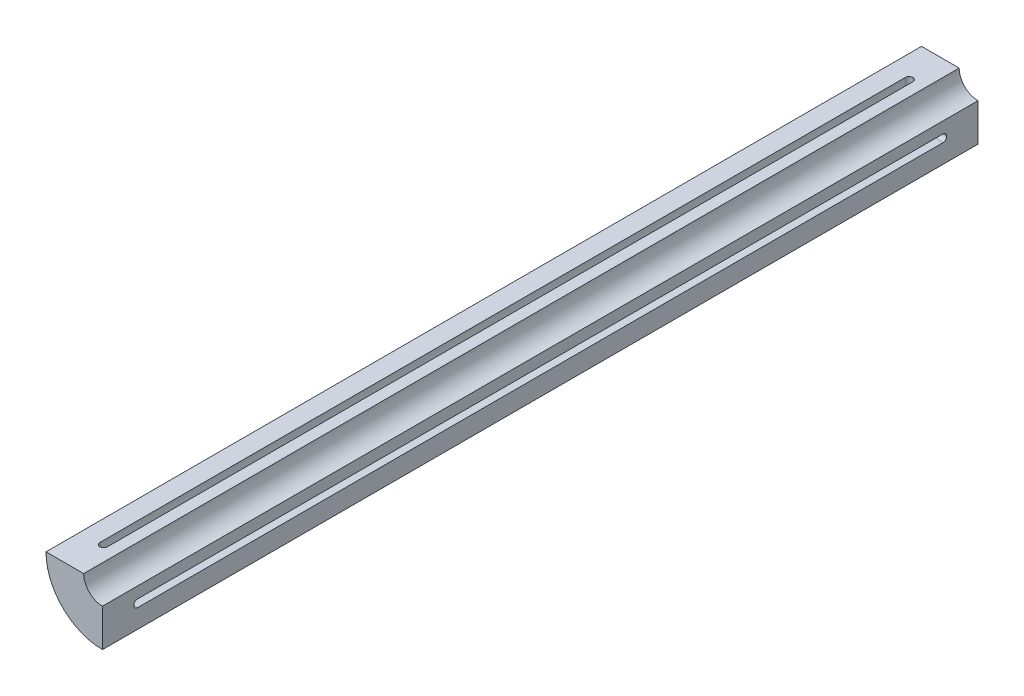
ISO-10303-21;
HEADER;
FILE_DESCRIPTION(('STEP AP214'),'2;1');
FILE_NAME('part.step','',(''),(''),'','','');
FILE_SCHEMA(('AUTOMOTIVE_DESIGN { 1 0 10303 214 1 1 1 1 }'));
ENDSEC;
DATA;
#1=APPLICATION_CONTEXT('core data for automotive mechanical design processes');
#2=APPLICATION_PROTOCOL_DEFINITION('international standard','automotive_design',2000,#1);
#3=PRODUCT_CONTEXT('',#1,'mechanical');
#4=PRODUCT('Part','Part','',(#3));
#5=PRODUCT_RELATED_PRODUCT_CATEGORY('part','',(#4));
#6=PRODUCT_DEFINITION_FORMATION('','',#4);
#7=PRODUCT_DEFINITION_CONTEXT('part definition',#1,'design');
#8=PRODUCT_DEFINITION('design','',#6,#7);
#9=PRODUCT_DEFINITION_SHAPE('','',#8);
#10=(LENGTH_UNIT() NAMED_UNIT(*) SI_UNIT(.MILLI.,.METRE.));
#11=(NAMED_UNIT(*) PLANE_ANGLE_UNIT() SI_UNIT($,.RADIAN.));
#12=(NAMED_UNIT(*) SI_UNIT($,.STERADIAN.) SOLID_ANGLE_UNIT());
#13=UNCERTAINTY_MEASURE_WITH_UNIT(LENGTH_MEASURE(1.E-05),#10,'distance_accuracy_value','');
#14=(GEOMETRIC_REPRESENTATION_CONTEXT(3) GLOBAL_UNCERTAINTY_ASSIGNED_CONTEXT((#13)) GLOBAL_UNIT_ASSIGNED_CONTEXT((#10,
#11,#12)) REPRESENTATION_CONTEXT('',''));
#15=CARTESIAN_POINT('',(0.,0.,0.));
#16=DIRECTION('',(0.,0.,1.));
#17=DIRECTION('',(1.,0.,0.));
#18=AXIS2_PLACEMENT_3D('',#15,#16,#17);
#19=CARTESIAN_POINT('',(0.,0.503476918148024,215.9));
#20=DIRECTION('',(0.,0.,-1.));
#21=DIRECTION('',(-1.,0.,0.));
#22=AXIS2_PLACEMENT_3D('',#19,#20,#21);
#23=CYLINDRICAL_SURFACE('',#22,10.);
#24=DIRECTION('',(0.,0.,-1.));
#25=VECTOR('',#24,1.);
#26=CARTESIAN_POINT('',(0.,-9.49652308185198,215.9));
#27=LINE('',#26,#25);
#28=CARTESIAN_POINT('',(0.,-9.49652308185198,214.9));
#29=VERTEX_POINT('',#28);
#30=CARTESIAN_POINT('',(0.,-9.49652308185198,1.));
#31=VERTEX_POINT('',#30);
#32=EDGE_CURVE('E161',#29,#31,#27,.T.);
#33=ORIENTED_EDGE('',*,*,#32,.T.);
#34=CARTESIAN_POINT('',(0.,0.503476918148024,1.));
#35=DIRECTION('',(0.,0.,-1.));
#36=DIRECTION('',(-1.,0.,0.));
#37=AXIS2_PLACEMENT_3D('',#34,#35,#36);
#38=CIRCLE('',#37,10.);
#39=CARTESIAN_POINT('',(-10.,0.503476918148024,1.));
#40=VERTEX_POINT('',#39);
#41=EDGE_CURVE('E178',#31,#40,#38,.T.);
#42=ORIENTED_EDGE('',*,*,#41,.T.);
#43=DIRECTION('',(0.,0.,-1.));
#44=VECTOR('',#43,1.);
#45=CARTESIAN_POINT('',(-10.,0.503476918148024,215.9));
#46=LINE('',#45,#44);
#47=CARTESIAN_POINT('',(-10.,0.503476918148024,214.9));
#48=VERTEX_POINT('',#47);
#49=EDGE_CURVE('E167',#48,#40,#46,.T.);
#50=ORIENTED_EDGE('',*,*,#49,.F.);
#51=CARTESIAN_POINT('',(0.,0.503476918148024,214.9));
#52=DIRECTION('',(0.,0.,1.));
#53=DIRECTION('',(1.,0.,0.));
#54=AXIS2_PLACEMENT_3D('',#51,#52,#53);
#55=CIRCLE('',#54,10.);
#56=EDGE_CURVE('E176',#48,#29,#55,.T.);
#57=ORIENTED_EDGE('',*,*,#56,.T.);
#58=EDGE_LOOP('',(#33,#42,#50,#57));
#59=FACE_BOUND('',#58,.T.);
#60=ADVANCED_FACE('F35',(#59),#23,.F.);
#61=CARTESIAN_POINT('',(-10.,0.503476918148024,215.9));
#62=DIRECTION('',(0.,-1.,0.));
#63=DIRECTION('',(1.,0.,0.));
#64=AXIS2_PLACEMENT_3D('',#61,#62,#63);
#65=PLANE('',#64);
#66=DIRECTION('',(1.,0.,0.));
#67=VECTOR('',#66,1.);
#68=CARTESIAN_POINT('',(-5.,0.503476918148024,-8.3));
#69=LINE('',#68,#67);
#70=CARTESIAN_POINT('',(-15.,0.503476918148026,-8.3));
#71=VERTEX_POINT('',#70);
#72=CARTESIAN_POINT('',(-5.,0.503476918148024,-8.3));
#73=VERTEX_POINT('',#72);
#74=EDGE_CURVE('E139',#71,#73,#69,.T.);
#75=ORIENTED_EDGE('',*,*,#74,.F.);
#76=DIRECTION('',(0.,0.,-1.));
#77=VECTOR('',#76,1.);
#78=CARTESIAN_POINT('',(-15.,0.503476918148023,215.9));
#79=LINE('',#78,#77);
#80=CARTESIAN_POINT('',(-15.,0.503476918148026,224.2));
#81=VERTEX_POINT('',#80);
#82=EDGE_CURVE('E165',#81,#71,#79,.T.);
#83=ORIENTED_EDGE('',*,*,#82,.F.);
#84=DIRECTION('',(-1.,0.,0.));
#85=VECTOR('',#84,1.);
#86=CARTESIAN_POINT('',(-5.,0.503476918148024,224.2));
#87=LINE('',#86,#85);
#88=CARTESIAN_POINT('',(-5.,0.503476918148024,224.2));
#89=VERTEX_POINT('',#88);
#90=EDGE_CURVE('E153',#89,#81,#87,.T.);
#91=ORIENTED_EDGE('',*,*,#90,.F.);
#92=DIRECTION('',(0.,0.,-1.));
#93=VECTOR('',#92,1.);
#94=CARTESIAN_POINT('',(-5.,0.503476918148024,224.2));
#95=LINE('',#94,#93);
#96=EDGE_CURVE('E124',#89,#73,#95,.T.);
#97=ORIENTED_EDGE('',*,*,#96,.T.);
#98=EDGE_LOOP('',(#75,#83,#91,#97));
#99=FACE_BOUND('',#98,.T.);
#100=CARTESIAN_POINT('',(-9.,0.503476918148023,214.9));
#101=DIRECTION('',(0.,-1.,0.));
#102=DIRECTION('',(1.,0.,0.));
#103=AXIS2_PLACEMENT_3D('',#100,#101,#102);
#104=CIRCLE('',#103,1.);
#105=CARTESIAN_POINT('',(-8.,0.503476918148024,214.9));
#106=VERTEX_POINT('',#105);
#107=CARTESIAN_POINT('',(-9.,0.503476918148024,215.9));
#108=VERTEX_POINT('',#107);
#109=EDGE_CURVE('E52',#106,#108,#104,.T.);
#110=ORIENTED_EDGE('',*,*,#109,.T.);
#111=CARTESIAN_POINT('',(-9.,0.503476918148023,214.9));
#112=DIRECTION('',(0.,-1.,0.));
#113=DIRECTION('',(1.,0.,0.));
#114=AXIS2_PLACEMENT_3D('',#111,#112,#113);
#115=CIRCLE('',#114,1.);
#116=EDGE_CURVE('E44',#108,#48,#115,.T.);
#117=ORIENTED_EDGE('',*,*,#116,.T.);
#118=ORIENTED_EDGE('',*,*,#49,.T.);
#119=CARTESIAN_POINT('',(-9.,0.503476918148023,1.));
#120=DIRECTION('',(0.,-1.,0.));
#121=DIRECTION('',(1.,0.,0.));
#122=AXIS2_PLACEMENT_3D('',#119,#120,#121);
#123=CIRCLE('',#122,1.);
#124=CARTESIAN_POINT('',(-9.,0.503476918148024,0.));
#125=VERTEX_POINT('',#124);
#126=EDGE_CURVE('E184',#40,#125,#123,.T.);
#127=ORIENTED_EDGE('',*,*,#126,.T.);
#128=CARTESIAN_POINT('',(-9.,0.503476918148023,1.));
#129=DIRECTION('',(0.,-1.,0.));
#130=DIRECTION('',(1.,0.,0.));
#131=AXIS2_PLACEMENT_3D('',#128,#129,#130);
#132=CIRCLE('',#131,1.);
#133=CARTESIAN_POINT('',(-8.,0.503476918148024,1.));
#134=VERTEX_POINT('',#133);
#135=EDGE_CURVE('E182',#125,#134,#132,.T.);
#136=ORIENTED_EDGE('',*,*,#135,.T.);
#137=DIRECTION('',(0.,0.,-1.));
#138=VECTOR('',#137,1.);
#139=CARTESIAN_POINT('',(-8.,0.503476918148024,215.9));
#140=LINE('',#139,#138);
#141=EDGE_CURVE('E146',#106,#134,#140,.T.);
#142=ORIENTED_EDGE('',*,*,#141,.F.);
#143=EDGE_LOOP('',(#110,#117,#118,#127,#136,#142));
#144=FACE_BOUND('',#143,.T.);
#145=ADVANCED_FACE('F192',(#99,#144),#65,.F.);
#146=CARTESIAN_POINT('',(0.,0.503476918148024,215.9));
#147=DIRECTION('',(0.,0.,-1.));
#148=DIRECTION('',(-1.,0.,0.));
#149=AXIS2_PLACEMENT_3D('',#146,#147,#148);
#150=CYLINDRICAL_SURFACE('',#149,15.);
#151=ORIENTED_EDGE('',*,*,#82,.T.);
#152=CARTESIAN_POINT('',(0.,0.503476918148024,-8.3));
#153=DIRECTION('',(0.,0.,-1.));
#154=DIRECTION('',(1.,0.,0.));
#155=AXIS2_PLACEMENT_3D('',#152,#153,#154);
#156=CIRCLE('',#155,15.);
#157=CARTESIAN_POINT('',(0.,-14.496523081852,-8.3));
#158=VERTEX_POINT('',#157);
#159=EDGE_CURVE('E134',#158,#71,#156,.T.);
#160=ORIENTED_EDGE('',*,*,#159,.F.);
#161=DIRECTION('',(0.,0.,-1.));
#162=VECTOR('',#161,1.);
#163=CARTESIAN_POINT('',(0.,-14.496523081852,215.9));
#164=LINE('',#163,#162);
#165=CARTESIAN_POINT('',(0.,-14.496523081852,224.2));
#166=VERTEX_POINT('',#165);
#167=EDGE_CURVE('E130',#166,#158,#164,.T.);
#168=ORIENTED_EDGE('',*,*,#167,.F.);
#169=CARTESIAN_POINT('',(0.,0.503476918148024,224.2));
#170=DIRECTION('',(0.,0.,1.));
#171=DIRECTION('',(1.,0.,0.));
#172=AXIS2_PLACEMENT_3D('',#169,#170,#171);
#173=CIRCLE('',#172,15.);
#174=EDGE_CURVE('E156',#81,#166,#173,.T.);
#175=ORIENTED_EDGE('',*,*,#174,.F.);
#176=EDGE_LOOP('',(#151,#160,#168,#175));
#177=FACE_BOUND('',#176,.T.);
#178=ADVANCED_FACE('F229',(#177),#150,.T.);
#179=CARTESIAN_POINT('',(0.,-9.49652308185198,215.9));
#180=DIRECTION('',(-1.,0.,0.));
#181=DIRECTION('',(0.,-1.,0.));
#182=AXIS2_PLACEMENT_3D('',#179,#180,#181);
#183=PLANE('',#182);
#184=CARTESIAN_POINT('',(0.,-8.49652308185198,1.));
#185=DIRECTION('',(-1.,0.,0.));
#186=DIRECTION('',(0.,-1.,0.));
#187=AXIS2_PLACEMENT_3D('',#184,#185,#186);
#188=CIRCLE('',#187,1.);
#189=CARTESIAN_POINT('',(0.,-7.49652308185198,1.));
#190=VERTEX_POINT('',#189);
#191=CARTESIAN_POINT('',(0.,-8.49652308185198,0.));
#192=VERTEX_POINT('',#191);
#193=EDGE_CURVE('E180',#190,#192,#188,.T.);
#194=ORIENTED_EDGE('',*,*,#193,.T.);
#195=CARTESIAN_POINT('',(0.,-8.49652308185198,1.));
#196=DIRECTION('',(-1.,0.,0.));
#197=DIRECTION('',(0.,-1.,0.));
#198=AXIS2_PLACEMENT_3D('',#195,#196,#197);
#199=CIRCLE('',#198,1.);
#200=EDGE_CURVE('E186',#192,#31,#199,.T.);
#201=ORIENTED_EDGE('',*,*,#200,.T.);
#202=ORIENTED_EDGE('',*,*,#32,.F.);
#203=CARTESIAN_POINT('',(0.,-8.49652308185198,214.9));
#204=DIRECTION('',(-1.,0.,0.));
#205=DIRECTION('',(0.,-1.,0.));
#206=AXIS2_PLACEMENT_3D('',#203,#204,#205);
#207=CIRCLE('',#206,1.);
#208=CARTESIAN_POINT('',(0.,-8.49652308185198,215.9));
#209=VERTEX_POINT('',#208);
#210=EDGE_CURVE('E11',#29,#209,#207,.T.);
#211=ORIENTED_EDGE('',*,*,#210,.T.);
#212=CARTESIAN_POINT('',(0.,-8.49652308185198,214.9));
#213=DIRECTION('',(-1.,0.,0.));
#214=DIRECTION('',(0.,-1.,0.));
#215=AXIS2_PLACEMENT_3D('',#212,#213,#214);
#216=CIRCLE('',#215,1.);
#217=CARTESIAN_POINT('',(0.,-7.49652308185198,214.9));
#218=VERTEX_POINT('',#217);
#219=EDGE_CURVE('E188',#209,#218,#216,.T.);
#220=ORIENTED_EDGE('',*,*,#219,.T.);
#221=DIRECTION('',(0.,0.,-1.));
#222=VECTOR('',#221,1.);
#223=CARTESIAN_POINT('',(0.,-7.49652308185198,215.9));
#224=LINE('',#223,#222);
#225=EDGE_CURVE('E149',#218,#190,#224,.T.);
#226=ORIENTED_EDGE('',*,*,#225,.T.);
#227=EDGE_LOOP('',(#194,#201,#202,#211,#220,#226));
#228=FACE_BOUND('',#227,.T.);
#229=ORIENTED_EDGE('',*,*,#167,.T.);
#230=DIRECTION('',(0.,-1.,0.));
#231=VECTOR('',#230,1.);
#232=CARTESIAN_POINT('',(0.,-14.496523081852,-8.3));
#233=LINE('',#232,#231);
#234=CARTESIAN_POINT('',(0.,-4.49652308185198,-8.3));
#235=VERTEX_POINT('',#234);
#236=EDGE_CURVE('E128',#235,#158,#233,.T.);
#237=ORIENTED_EDGE('',*,*,#236,.F.);
#238=DIRECTION('',(0.,0.,-1.));
#239=VECTOR('',#238,1.);
#240=CARTESIAN_POINT('',(0.,-4.49652308185198,224.2));
#241=LINE('',#240,#239);
#242=CARTESIAN_POINT('',(0.,-4.49652308185198,224.2));
#243=VERTEX_POINT('',#242);
#244=EDGE_CURVE('E114',#243,#235,#241,.T.);
#245=ORIENTED_EDGE('',*,*,#244,.F.);
#246=DIRECTION('',(0.,1.,0.));
#247=VECTOR('',#246,1.);
#248=CARTESIAN_POINT('',(0.,-4.49652308185198,224.2));
#249=LINE('',#248,#247);
#250=EDGE_CURVE('E125',#166,#243,#249,.T.);
#251=ORIENTED_EDGE('',*,*,#250,.F.);
#252=EDGE_LOOP('',(#229,#237,#245,#251));
#253=FACE_BOUND('',#252,.T.);
#254=ADVANCED_FACE('F129',(#228,#253),#183,.F.);
#255=CARTESIAN_POINT('',(0.,0.503476918148024,224.2));
#256=DIRECTION('',(0.,0.,-1.));
#257=DIRECTION('',(-1.,0.,0.));
#258=AXIS2_PLACEMENT_3D('',#255,#256,#257);
#259=CYLINDRICAL_SURFACE('',#258,5.);
#260=ORIENTED_EDGE('',*,*,#244,.T.);
#261=CARTESIAN_POINT('',(0.,0.503476918148024,-8.3));
#262=DIRECTION('',(0.,0.,1.));
#263=DIRECTION('',(-1.,0.,0.));
#264=AXIS2_PLACEMENT_3D('',#261,#262,#263);
#265=CIRCLE('',#264,5.);
#266=EDGE_CURVE('E119',#73,#235,#265,.T.);
#267=ORIENTED_EDGE('',*,*,#266,.F.);
#268=ORIENTED_EDGE('',*,*,#96,.F.);
#269=CARTESIAN_POINT('',(0.,0.503476918148024,224.2));
#270=DIRECTION('',(0.,0.,-1.));
#271=DIRECTION('',(1.,0.,0.));
#272=AXIS2_PLACEMENT_3D('',#269,#270,#271);
#273=CIRCLE('',#272,5.);
#274=EDGE_CURVE('E121',#243,#89,#273,.T.);
#275=ORIENTED_EDGE('',*,*,#274,.F.);
#276=EDGE_LOOP('',(#260,#267,#268,#275));
#277=FACE_BOUND('',#276,.T.);
#278=ADVANCED_FACE('F116',(#277),#259,.F.);
#279=CARTESIAN_POINT('',(0.,0.503476918148024,224.2));
#280=DIRECTION('',(0.,0.,1.));
#281=DIRECTION('',(1.,0.,0.));
#282=AXIS2_PLACEMENT_3D('',#279,#280,#281);
#283=PLANE('',#282);
#284=ORIENTED_EDGE('',*,*,#274,.T.);
#285=ORIENTED_EDGE('',*,*,#90,.T.);
#286=ORIENTED_EDGE('',*,*,#174,.T.);
#287=ORIENTED_EDGE('',*,*,#250,.T.);
#288=EDGE_LOOP('',(#284,#285,#286,#287));
#289=FACE_BOUND('',#288,.T.);
#290=ADVANCED_FACE('F240',(#289),#283,.T.);
#291=CARTESIAN_POINT('',(0.,0.503476918148024,215.9));
#292=DIRECTION('',(0.,0.,-1.));
#293=DIRECTION('',(-1.,0.,0.));
#294=AXIS2_PLACEMENT_3D('',#291,#292,#293);
#295=CYLINDRICAL_SURFACE('',#294,8.);
#296=ORIENTED_EDGE('',*,*,#141,.T.);
#297=CARTESIAN_POINT('',(0.,0.503476918148024,1.));
#298=DIRECTION('',(0.,0.,-1.));
#299=DIRECTION('',(-1.,0.,0.));
#300=AXIS2_PLACEMENT_3D('',#297,#298,#299);
#301=CIRCLE('',#300,8.);
#302=EDGE_CURVE('E173',#134,#190,#301,.F.);
#303=ORIENTED_EDGE('',*,*,#302,.T.);
#304=ORIENTED_EDGE('',*,*,#225,.F.);
#305=CARTESIAN_POINT('',(0.,0.503476918148024,214.9));
#306=DIRECTION('',(0.,0.,1.));
#307=DIRECTION('',(1.,0.,0.));
#308=AXIS2_PLACEMENT_3D('',#305,#306,#307);
#309=CIRCLE('',#308,8.);
#310=EDGE_CURVE('E170',#218,#106,#309,.F.);
#311=ORIENTED_EDGE('',*,*,#310,.T.);
#312=EDGE_LOOP('',(#296,#303,#304,#311));
#313=FACE_BOUND('',#312,.T.);
#314=ADVANCED_FACE('F205',(#313),#295,.T.);
#315=CARTESIAN_POINT('',(0.,0.503476918148024,-8.3));
#316=DIRECTION('',(0.,0.,-1.));
#317=DIRECTION('',(-1.,0.,0.));
#318=AXIS2_PLACEMENT_3D('',#315,#316,#317);
#319=PLANE('',#318);
#320=ORIENTED_EDGE('',*,*,#266,.T.);
#321=ORIENTED_EDGE('',*,*,#236,.T.);
#322=ORIENTED_EDGE('',*,*,#159,.T.);
#323=ORIENTED_EDGE('',*,*,#74,.T.);
#324=EDGE_LOOP('',(#320,#321,#322,#323));
#325=FACE_BOUND('',#324,.T.);
#326=ADVANCED_FACE('F137',(#325),#319,.T.);
#327=CARTESIAN_POINT('',(0.,0.503476918148024,1.));
#328=DIRECTION('',(0.,0.,-1.));
#329=DIRECTION('',(-1.,0.,0.));
#330=AXIS2_PLACEMENT_3D('',#327,#328,#329);
#331=TOROIDAL_SURFACE('',#330,9.,1.);
#332=CARTESIAN_POINT('',(0.,0.503476918148024,0.));
#333=DIRECTION('',(0.,0.,-1.));
#334=DIRECTION('',(-1.,0.,0.));
#335=AXIS2_PLACEMENT_3D('',#332,#333,#334);
#336=CIRCLE('',#335,9.);
#337=EDGE_CURVE('E140',#125,#192,#336,.F.);
#338=ORIENTED_EDGE('',*,*,#337,.F.);
#339=ORIENTED_EDGE('',*,*,#126,.F.);
#340=ORIENTED_EDGE('',*,*,#41,.F.);
#341=ORIENTED_EDGE('',*,*,#200,.F.);
#342=EDGE_LOOP('',(#338,#339,#340,#341));
#343=FACE_BOUND('',#342,.T.);
#344=ADVANCED_FACE('F213',(#343),#331,.F.);
#345=CARTESIAN_POINT('',(0.,0.503476918148024,1.));
#346=DIRECTION('',(0.,0.,-1.));
#347=DIRECTION('',(-1.,0.,0.));
#348=AXIS2_PLACEMENT_3D('',#345,#346,#347);
#349=TOROIDAL_SURFACE('',#348,9.,1.);
#350=ORIENTED_EDGE('',*,*,#135,.F.);
#351=ORIENTED_EDGE('',*,*,#337,.T.);
#352=ORIENTED_EDGE('',*,*,#193,.F.);
#353=ORIENTED_EDGE('',*,*,#302,.F.);
#354=EDGE_LOOP('',(#350,#351,#352,#353));
#355=FACE_BOUND('',#354,.T.);
#356=ADVANCED_FACE('F209',(#355),#349,.F.);
#357=CARTESIAN_POINT('',(0.,0.503476918148024,214.9));
#358=DIRECTION('',(0.,0.,1.));
#359=DIRECTION('',(1.,0.,0.));
#360=AXIS2_PLACEMENT_3D('',#357,#358,#359);
#361=TOROIDAL_SURFACE('',#360,9.,1.);
#362=ORIENTED_EDGE('',*,*,#56,.F.);
#363=ORIENTED_EDGE('',*,*,#116,.F.);
#364=CARTESIAN_POINT('',(0.,0.503476918148024,215.9));
#365=DIRECTION('',(0.,0.,1.));
#366=DIRECTION('',(1.,0.,0.));
#367=AXIS2_PLACEMENT_3D('',#364,#365,#366);
#368=CIRCLE('',#367,9.);
#369=EDGE_CURVE('E39',#209,#108,#368,.F.);
#370=ORIENTED_EDGE('',*,*,#369,.F.);
#371=ORIENTED_EDGE('',*,*,#210,.F.);
#372=EDGE_LOOP('',(#362,#363,#370,#371));
#373=FACE_BOUND('',#372,.T.);
#374=ADVANCED_FACE('F37',(#373),#361,.F.);
#375=CARTESIAN_POINT('',(0.,0.503476918148024,214.9));
#376=DIRECTION('',(0.,0.,1.));
#377=DIRECTION('',(1.,0.,0.));
#378=AXIS2_PLACEMENT_3D('',#375,#376,#377);
#379=TOROIDAL_SURFACE('',#378,9.,1.);
#380=ORIENTED_EDGE('',*,*,#109,.F.);
#381=ORIENTED_EDGE('',*,*,#310,.F.);
#382=ORIENTED_EDGE('',*,*,#219,.F.);
#383=ORIENTED_EDGE('',*,*,#369,.T.);
#384=EDGE_LOOP('',(#380,#381,#382,#383));
#385=FACE_BOUND('',#384,.T.);
#386=ADVANCED_FACE('F202',(#385),#379,.F.);
#387=CLOSED_SHELL('',(#60,#145,#178,#254,#278,#290,#314,#326,#344,#356,#374,#386));
#388=MANIFOLD_SOLID_BREP('B2',#387);
#389=ADVANCED_BREP_SHAPE_REPRESENTATION('',(#18,#388),#14);
#390=SHAPE_DEFINITION_REPRESENTATION(#9,#389);
ENDSEC;
END-ISO-10303-21;
